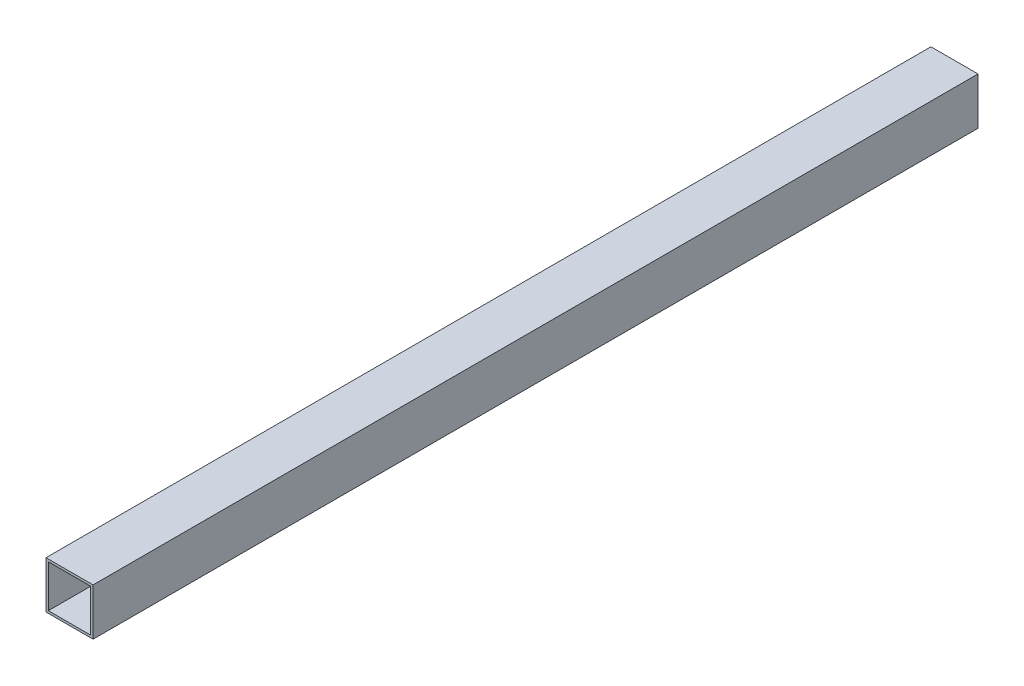
ISO-10303-21;
HEADER;
FILE_DESCRIPTION(('STEP AP214'),'2;1');
FILE_NAME('part.step','',(''),(''),'','','');
FILE_SCHEMA(('AUTOMOTIVE_DESIGN { 1 0 10303 214 1 1 1 1 }'));
ENDSEC;
DATA;
#1=APPLICATION_CONTEXT('core data for automotive mechanical design processes');
#2=APPLICATION_PROTOCOL_DEFINITION('international standard','automotive_design',2000,#1);
#3=PRODUCT_CONTEXT('',#1,'mechanical');
#4=PRODUCT('Part','Part','',(#3));
#5=PRODUCT_RELATED_PRODUCT_CATEGORY('part','',(#4));
#6=PRODUCT_DEFINITION_FORMATION('','',#4);
#7=PRODUCT_DEFINITION_CONTEXT('part definition',#1,'design');
#8=PRODUCT_DEFINITION('design','',#6,#7);
#9=PRODUCT_DEFINITION_SHAPE('','',#8);
#10=(LENGTH_UNIT() NAMED_UNIT(*) SI_UNIT(.MILLI.,.METRE.));
#11=(NAMED_UNIT(*) PLANE_ANGLE_UNIT() SI_UNIT($,.RADIAN.));
#12=(NAMED_UNIT(*) SI_UNIT($,.STERADIAN.) SOLID_ANGLE_UNIT());
#13=UNCERTAINTY_MEASURE_WITH_UNIT(LENGTH_MEASURE(1.E-05),#10,'distance_accuracy_value','');
#14=(GEOMETRIC_REPRESENTATION_CONTEXT(3) GLOBAL_UNCERTAINTY_ASSIGNED_CONTEXT((#13)) GLOBAL_UNIT_ASSIGNED_CONTEXT((#10,
#11,#12)) REPRESENTATION_CONTEXT('',''));
#15=CARTESIAN_POINT('',(0.,0.,0.));
#16=DIRECTION('',(0.,0.,1.));
#17=DIRECTION('',(1.,0.,0.));
#18=AXIS2_PLACEMENT_3D('',#15,#16,#17);
#19=CARTESIAN_POINT('',(0.,0.,940.));
#20=DIRECTION('',(0.,0.,-1.));
#21=DIRECTION('',(-1.,0.,0.));
#22=AXIS2_PLACEMENT_3D('',#19,#20,#21);
#23=PLANE('',#22);
#24=DIRECTION('',(0.,-1.,0.));
#25=VECTOR('',#24,1.);
#26=CARTESIAN_POINT('',(-50.,-50.,940.));
#27=LINE('',#26,#25);
#28=CARTESIAN_POINT('',(-50.,49.9999999999999,940.));
#29=VERTEX_POINT('',#28);
#30=CARTESIAN_POINT('',(-50.,-50.,940.));
#31=VERTEX_POINT('',#30);
#32=EDGE_CURVE('E133',#29,#31,#27,.T.);
#33=ORIENTED_EDGE('',*,*,#32,.T.);
#34=DIRECTION('',(1.,0.,0.));
#35=VECTOR('',#34,1.);
#36=CARTESIAN_POINT('',(-50.,-50.,940.));
#37=LINE('',#36,#35);
#38=CARTESIAN_POINT('',(50.,-50.,940.));
#39=VERTEX_POINT('',#38);
#40=EDGE_CURVE('E136',#31,#39,#37,.T.);
#41=ORIENTED_EDGE('',*,*,#40,.T.);
#42=DIRECTION('',(0.,1.,0.));
#43=VECTOR('',#42,1.);
#44=CARTESIAN_POINT('',(50.,-50.,940.));
#45=LINE('',#44,#43);
#46=CARTESIAN_POINT('',(49.9999999999999,49.9999999999999,940.));
#47=VERTEX_POINT('',#46);
#48=EDGE_CURVE('E139',#39,#47,#45,.T.);
#49=ORIENTED_EDGE('',*,*,#48,.T.);
#50=DIRECTION('',(-1.,0.,0.));
#51=VECTOR('',#50,1.);
#52=CARTESIAN_POINT('',(-50.,49.9999999999999,940.));
#53=LINE('',#52,#51);
#54=EDGE_CURVE('E141',#47,#29,#53,.T.);
#55=ORIENTED_EDGE('',*,*,#54,.T.);
#56=EDGE_LOOP('',(#33,#41,#49,#55));
#57=FACE_BOUND('',#56,.T.);
#58=DIRECTION('',(0.,-1.,0.));
#59=VECTOR('',#58,1.);
#60=CARTESIAN_POINT('',(-45.,-45.,940.));
#61=LINE('',#60,#59);
#62=CARTESIAN_POINT('',(-45.,44.9999999999999,940.));
#63=VERTEX_POINT('',#62);
#64=CARTESIAN_POINT('',(-45.,-45.,940.));
#65=VERTEX_POINT('',#64);
#66=EDGE_CURVE('E97',#63,#65,#61,.T.);
#67=ORIENTED_EDGE('',*,*,#66,.F.);
#68=DIRECTION('',(-1.,0.,0.));
#69=VECTOR('',#68,1.);
#70=CARTESIAN_POINT('',(-45.,44.9999999999999,940.));
#71=LINE('',#70,#69);
#72=CARTESIAN_POINT('',(45.,44.9999999999999,940.));
#73=VERTEX_POINT('',#72);
#74=EDGE_CURVE('E119',#73,#63,#71,.T.);
#75=ORIENTED_EDGE('',*,*,#74,.F.);
#76=DIRECTION('',(0.,1.,0.));
#77=VECTOR('',#76,1.);
#78=CARTESIAN_POINT('',(45.,-45.,940.));
#79=LINE('',#78,#77);
#80=CARTESIAN_POINT('',(45.,-45.,940.));
#81=VERTEX_POINT('',#80);
#82=EDGE_CURVE('E117',#81,#73,#79,.T.);
#83=ORIENTED_EDGE('',*,*,#82,.F.);
#84=DIRECTION('',(1.,0.,0.));
#85=VECTOR('',#84,1.);
#86=CARTESIAN_POINT('',(-45.,-45.,940.));
#87=LINE('',#86,#85);
#88=EDGE_CURVE('E105',#65,#81,#87,.T.);
#89=ORIENTED_EDGE('',*,*,#88,.F.);
#90=EDGE_LOOP('',(#67,#75,#83,#89));
#91=FACE_BOUND('',#90,.T.);
#92=ADVANCED_FACE('F32',(#57,#91),#23,.F.);
#93=CARTESIAN_POINT('',(0.,0.,-940.));
#94=DIRECTION('',(0.,0.,-1.));
#95=DIRECTION('',(-1.,0.,0.));
#96=AXIS2_PLACEMENT_3D('',#93,#94,#95);
#97=PLANE('',#96);
#98=DIRECTION('',(0.,-1.,0.));
#99=VECTOR('',#98,1.);
#100=CARTESIAN_POINT('',(-50.,-50.,-940.));
#101=LINE('',#100,#99);
#102=CARTESIAN_POINT('',(-50.,49.9999999999999,-940.));
#103=VERTEX_POINT('',#102);
#104=CARTESIAN_POINT('',(-50.,-50.,-940.));
#105=VERTEX_POINT('',#104);
#106=EDGE_CURVE('E113',#103,#105,#101,.T.);
#107=ORIENTED_EDGE('',*,*,#106,.F.);
#108=DIRECTION('',(-1.,0.,0.));
#109=VECTOR('',#108,1.);
#110=CARTESIAN_POINT('',(-50.,49.9999999999999,-940.));
#111=LINE('',#110,#109);
#112=CARTESIAN_POINT('',(49.9999999999999,49.9999999999999,-940.));
#113=VERTEX_POINT('',#112);
#114=EDGE_CURVE('E137',#113,#103,#111,.T.);
#115=ORIENTED_EDGE('',*,*,#114,.F.);
#116=DIRECTION('',(0.,1.,0.));
#117=VECTOR('',#116,1.);
#118=CARTESIAN_POINT('',(50.,-50.,-940.));
#119=LINE('',#118,#117);
#120=CARTESIAN_POINT('',(50.,-50.,-940.));
#121=VERTEX_POINT('',#120);
#122=EDGE_CURVE('E148',#121,#113,#119,.T.);
#123=ORIENTED_EDGE('',*,*,#122,.F.);
#124=DIRECTION('',(1.,0.,0.));
#125=VECTOR('',#124,1.);
#126=CARTESIAN_POINT('',(-50.,-50.,-940.));
#127=LINE('',#126,#125);
#128=EDGE_CURVE('E146',#105,#121,#127,.T.);
#129=ORIENTED_EDGE('',*,*,#128,.F.);
#130=EDGE_LOOP('',(#107,#115,#123,#129));
#131=FACE_BOUND('',#130,.T.);
#132=DIRECTION('',(-1.,0.,0.));
#133=VECTOR('',#132,1.);
#134=CARTESIAN_POINT('',(-45.,44.9999999999999,-940.));
#135=LINE('',#134,#133);
#136=CARTESIAN_POINT('',(45.,44.9999999999999,-940.));
#137=VERTEX_POINT('',#136);
#138=CARTESIAN_POINT('',(-45.,44.9999999999999,-940.));
#139=VERTEX_POINT('',#138);
#140=EDGE_CURVE('E106',#137,#139,#135,.T.);
#141=ORIENTED_EDGE('',*,*,#140,.T.);
#142=DIRECTION('',(0.,-1.,0.));
#143=VECTOR('',#142,1.);
#144=CARTESIAN_POINT('',(-45.,-45.,-940.));
#145=LINE('',#144,#143);
#146=CARTESIAN_POINT('',(-45.,-45.,-940.));
#147=VERTEX_POINT('',#146);
#148=EDGE_CURVE('E55',#139,#147,#145,.T.);
#149=ORIENTED_EDGE('',*,*,#148,.T.);
#150=DIRECTION('',(1.,0.,0.));
#151=VECTOR('',#150,1.);
#152=CARTESIAN_POINT('',(-45.,-45.,-940.));
#153=LINE('',#152,#151);
#154=CARTESIAN_POINT('',(45.,-45.,-940.));
#155=VERTEX_POINT('',#154);
#156=EDGE_CURVE('E112',#147,#155,#153,.T.);
#157=ORIENTED_EDGE('',*,*,#156,.T.);
#158=DIRECTION('',(0.,1.,0.));
#159=VECTOR('',#158,1.);
#160=CARTESIAN_POINT('',(45.,-45.,-940.));
#161=LINE('',#160,#159);
#162=EDGE_CURVE('E125',#155,#137,#161,.T.);
#163=ORIENTED_EDGE('',*,*,#162,.T.);
#164=EDGE_LOOP('',(#141,#149,#157,#163));
#165=FACE_BOUND('',#164,.T.);
#166=ADVANCED_FACE('F166',(#131,#165),#97,.T.);
#167=CARTESIAN_POINT('',(-50.,-50.,940.));
#168=DIRECTION('',(1.,0.,0.));
#169=DIRECTION('',(0.,0.,-1.));
#170=AXIS2_PLACEMENT_3D('',#167,#168,#169);
#171=PLANE('',#170);
#172=ORIENTED_EDGE('',*,*,#106,.T.);
#173=DIRECTION('',(0.,0.,-1.));
#174=VECTOR('',#173,1.);
#175=CARTESIAN_POINT('',(-50.,-50.,940.));
#176=LINE('',#175,#174);
#177=EDGE_CURVE('E11',#31,#105,#176,.T.);
#178=ORIENTED_EDGE('',*,*,#177,.F.);
#179=ORIENTED_EDGE('',*,*,#32,.F.);
#180=DIRECTION('',(0.,0.,-1.));
#181=VECTOR('',#180,1.);
#182=CARTESIAN_POINT('',(-50.,49.9999999999999,940.));
#183=LINE('',#182,#181);
#184=EDGE_CURVE('E143',#29,#103,#183,.T.);
#185=ORIENTED_EDGE('',*,*,#184,.T.);
#186=EDGE_LOOP('',(#172,#178,#179,#185));
#187=FACE_BOUND('',#186,.T.);
#188=ADVANCED_FACE('F34',(#187),#171,.F.);
#189=CARTESIAN_POINT('',(-50.,-50.,940.));
#190=DIRECTION('',(0.,1.,0.));
#191=DIRECTION('',(0.,0.,1.));
#192=AXIS2_PLACEMENT_3D('',#189,#190,#191);
#193=PLANE('',#192);
#194=ORIENTED_EDGE('',*,*,#128,.T.);
#195=DIRECTION('',(0.,0.,-1.));
#196=VECTOR('',#195,1.);
#197=CARTESIAN_POINT('',(50.,-50.,940.));
#198=LINE('',#197,#196);
#199=EDGE_CURVE('E40',#39,#121,#198,.T.);
#200=ORIENTED_EDGE('',*,*,#199,.F.);
#201=ORIENTED_EDGE('',*,*,#40,.F.);
#202=ORIENTED_EDGE('',*,*,#177,.T.);
#203=EDGE_LOOP('',(#194,#200,#201,#202));
#204=FACE_BOUND('',#203,.T.);
#205=ADVANCED_FACE('F176',(#204),#193,.F.);
#206=CARTESIAN_POINT('',(50.,-50.,940.));
#207=DIRECTION('',(-1.,0.,0.));
#208=DIRECTION('',(0.,-1.,0.));
#209=AXIS2_PLACEMENT_3D('',#206,#207,#208);
#210=PLANE('',#209);
#211=ORIENTED_EDGE('',*,*,#122,.T.);
#212=DIRECTION('',(0.,0.,-1.));
#213=VECTOR('',#212,1.);
#214=CARTESIAN_POINT('',(49.9999999999999,49.9999999999999,940.));
#215=LINE('',#214,#213);
#216=EDGE_CURVE('E153',#47,#113,#215,.T.);
#217=ORIENTED_EDGE('',*,*,#216,.F.);
#218=ORIENTED_EDGE('',*,*,#48,.F.);
#219=ORIENTED_EDGE('',*,*,#199,.T.);
#220=EDGE_LOOP('',(#211,#217,#218,#219));
#221=FACE_BOUND('',#220,.T.);
#222=ADVANCED_FACE('F160',(#221),#210,.F.);
#223=CARTESIAN_POINT('',(-50.,49.9999999999999,940.));
#224=DIRECTION('',(0.,-1.,0.));
#225=DIRECTION('',(0.,0.,-1.));
#226=AXIS2_PLACEMENT_3D('',#223,#224,#225);
#227=PLANE('',#226);
#228=ORIENTED_EDGE('',*,*,#114,.T.);
#229=ORIENTED_EDGE('',*,*,#184,.F.);
#230=ORIENTED_EDGE('',*,*,#54,.F.);
#231=ORIENTED_EDGE('',*,*,#216,.T.);
#232=EDGE_LOOP('',(#228,#229,#230,#231));
#233=FACE_BOUND('',#232,.T.);
#234=ADVANCED_FACE('F170',(#233),#227,.F.);
#235=CARTESIAN_POINT('',(-45.,-45.,940.));
#236=DIRECTION('',(1.,0.,0.));
#237=DIRECTION('',(0.,0.,-1.));
#238=AXIS2_PLACEMENT_3D('',#235,#236,#237);
#239=PLANE('',#238);
#240=ORIENTED_EDGE('',*,*,#148,.F.);
#241=DIRECTION('',(0.,0.,-1.));
#242=VECTOR('',#241,1.);
#243=CARTESIAN_POINT('',(-45.,44.9999999999999,940.));
#244=LINE('',#243,#242);
#245=EDGE_CURVE('E101',#63,#139,#244,.T.);
#246=ORIENTED_EDGE('',*,*,#245,.F.);
#247=ORIENTED_EDGE('',*,*,#66,.T.);
#248=DIRECTION('',(0.,0.,-1.));
#249=VECTOR('',#248,1.);
#250=CARTESIAN_POINT('',(-45.,-45.,940.));
#251=LINE('',#250,#249);
#252=EDGE_CURVE('E100',#65,#147,#251,.T.);
#253=ORIENTED_EDGE('',*,*,#252,.T.);
#254=EDGE_LOOP('',(#240,#246,#247,#253));
#255=FACE_BOUND('',#254,.T.);
#256=ADVANCED_FACE('F99',(#255),#239,.T.);
#257=CARTESIAN_POINT('',(-45.,-45.,940.));
#258=DIRECTION('',(0.,1.,0.));
#259=DIRECTION('',(0.,0.,1.));
#260=AXIS2_PLACEMENT_3D('',#257,#258,#259);
#261=PLANE('',#260);
#262=ORIENTED_EDGE('',*,*,#156,.F.);
#263=ORIENTED_EDGE('',*,*,#252,.F.);
#264=ORIENTED_EDGE('',*,*,#88,.T.);
#265=DIRECTION('',(0.,0.,-1.));
#266=VECTOR('',#265,1.);
#267=CARTESIAN_POINT('',(45.,-45.,940.));
#268=LINE('',#267,#266);
#269=EDGE_CURVE('E114',#81,#155,#268,.T.);
#270=ORIENTED_EDGE('',*,*,#269,.T.);
#271=EDGE_LOOP('',(#262,#263,#264,#270));
#272=FACE_BOUND('',#271,.T.);
#273=ADVANCED_FACE('F109',(#272),#261,.T.);
#274=CARTESIAN_POINT('',(45.,-45.,940.));
#275=DIRECTION('',(-1.,0.,0.));
#276=DIRECTION('',(0.,-1.,0.));
#277=AXIS2_PLACEMENT_3D('',#274,#275,#276);
#278=PLANE('',#277);
#279=ORIENTED_EDGE('',*,*,#162,.F.);
#280=ORIENTED_EDGE('',*,*,#269,.F.);
#281=ORIENTED_EDGE('',*,*,#82,.T.);
#282=DIRECTION('',(0.,0.,-1.));
#283=VECTOR('',#282,1.);
#284=CARTESIAN_POINT('',(45.,44.9999999999999,940.));
#285=LINE('',#284,#283);
#286=EDGE_CURVE('E47',#73,#137,#285,.T.);
#287=ORIENTED_EDGE('',*,*,#286,.T.);
#288=EDGE_LOOP('',(#279,#280,#281,#287));
#289=FACE_BOUND('',#288,.T.);
#290=ADVANCED_FACE('F199',(#289),#278,.T.);
#291=CARTESIAN_POINT('',(-45.,44.9999999999999,940.));
#292=DIRECTION('',(0.,-1.,0.));
#293=DIRECTION('',(0.,0.,-1.));
#294=AXIS2_PLACEMENT_3D('',#291,#292,#293);
#295=PLANE('',#294);
#296=ORIENTED_EDGE('',*,*,#140,.F.);
#297=ORIENTED_EDGE('',*,*,#286,.F.);
#298=ORIENTED_EDGE('',*,*,#74,.T.);
#299=ORIENTED_EDGE('',*,*,#245,.T.);
#300=EDGE_LOOP('',(#296,#297,#298,#299));
#301=FACE_BOUND('',#300,.T.);
#302=ADVANCED_FACE('F203',(#301),#295,.T.);
#303=CLOSED_SHELL('',(#92,#166,#188,#205,#222,#234,#256,#273,#290,#302));
#304=MANIFOLD_SOLID_BREP('B2',#303);
#305=ADVANCED_BREP_SHAPE_REPRESENTATION('',(#18,#304),#14);
#306=SHAPE_DEFINITION_REPRESENTATION(#9,#305);
ENDSEC;
END-ISO-10303-21;
